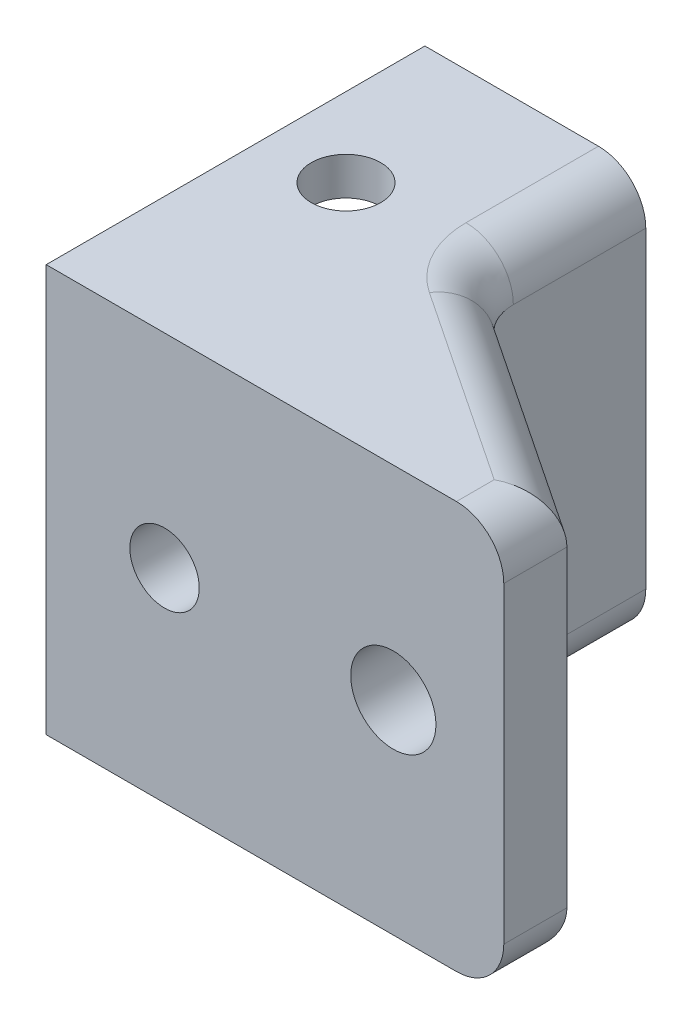
ISO-10303-21;
HEADER;
FILE_DESCRIPTION(('STEP AP214'),'2;1');
FILE_NAME('part.step','',(''),(''),'','','');
FILE_SCHEMA(('AUTOMOTIVE_DESIGN { 1 0 10303 214 1 1 1 1 }'));
ENDSEC;
DATA;
#1=APPLICATION_CONTEXT('core data for automotive mechanical design processes');
#2=APPLICATION_PROTOCOL_DEFINITION('international standard','automotive_design',2000,#1);
#3=PRODUCT_CONTEXT('',#1,'mechanical');
#4=PRODUCT('Part','Part','',(#3));
#5=PRODUCT_RELATED_PRODUCT_CATEGORY('part','',(#4));
#6=PRODUCT_DEFINITION_FORMATION('','',#4);
#7=PRODUCT_DEFINITION_CONTEXT('part definition',#1,'design');
#8=PRODUCT_DEFINITION('design','',#6,#7);
#9=PRODUCT_DEFINITION_SHAPE('','',#8);
#10=(LENGTH_UNIT() NAMED_UNIT(*) SI_UNIT(.MILLI.,.METRE.));
#11=(NAMED_UNIT(*) PLANE_ANGLE_UNIT() SI_UNIT($,.RADIAN.));
#12=(NAMED_UNIT(*) SI_UNIT($,.STERADIAN.) SOLID_ANGLE_UNIT());
#13=UNCERTAINTY_MEASURE_WITH_UNIT(LENGTH_MEASURE(1.E-05),#10,'distance_accuracy_value','');
#14=(GEOMETRIC_REPRESENTATION_CONTEXT(3) GLOBAL_UNCERTAINTY_ASSIGNED_CONTEXT((#13)) GLOBAL_UNIT_ASSIGNED_CONTEXT((#10,
#11,#12)) REPRESENTATION_CONTEXT('',''));
#15=CARTESIAN_POINT('',(0.,0.,0.));
#16=DIRECTION('',(0.,0.,1.));
#17=DIRECTION('',(1.,0.,0.));
#18=AXIS2_PLACEMENT_3D('',#15,#16,#17);
#19=CARTESIAN_POINT('',(0.,0.,0.));
#20=DIRECTION('',(0.,0.,1.));
#21=DIRECTION('',(1.,0.,0.));
#22=AXIS2_PLACEMENT_3D('',#19,#20,#21);
#23=PLANE('',#22);
#24=CARTESIAN_POINT('',(0.,0.,0.));
#25=DIRECTION('',(0.,0.,1.));
#26=DIRECTION('',(1.,0.,0.));
#27=AXIS2_PLACEMENT_3D('',#24,#25,#26);
#28=CIRCLE('',#27,2.7);
#29=CARTESIAN_POINT('',(2.7,0.,0.));
#30=VERTEX_POINT('',#29);
#31=EDGE_CURVE('E688',#30,#30,#28,.T.);
#32=ORIENTED_EDGE('',*,*,#31,.T.);
#33=EDGE_LOOP('',(#32));
#34=FACE_BOUND('',#33,.T.);
#35=DIRECTION('',(1.,0.,0.));
#36=VECTOR('',#35,1.);
#37=CARTESIAN_POINT('',(0.,-9.9,0.));
#38=LINE('',#37,#36);
#39=CARTESIAN_POINT('',(-8.,-9.9,0.));
#40=VERTEX_POINT('',#39);
#41=CARTESIAN_POINT('',(7.,-9.9,0.));
#42=VERTEX_POINT('',#41);
#43=EDGE_CURVE('E173',#40,#42,#38,.T.);
#44=ORIENTED_EDGE('',*,*,#43,.F.);
#45=DIRECTION('',(0.,-1.,0.));
#46=VECTOR('',#45,1.);
#47=CARTESIAN_POINT('',(-8.,0.,0.));
#48=LINE('',#47,#46);
#49=CARTESIAN_POINT('',(-8.,9.9,0.));
#50=VERTEX_POINT('',#49);
#51=EDGE_CURVE('E158',#50,#40,#48,.T.);
#52=ORIENTED_EDGE('',*,*,#51,.F.);
#53=DIRECTION('',(-1.,0.,0.));
#54=VECTOR('',#53,1.);
#55=CARTESIAN_POINT('',(0.,9.9,0.));
#56=LINE('',#55,#54);
#57=CARTESIAN_POINT('',(7.,9.9,0.));
#58=VERTEX_POINT('',#57);
#59=EDGE_CURVE('E186',#58,#50,#56,.T.);
#60=ORIENTED_EDGE('',*,*,#59,.F.);
#61=DIRECTION('',(0.,-1.,0.));
#62=VECTOR('',#61,1.);
#63=CARTESIAN_POINT('',(7.,0.,0.));
#64=LINE('',#63,#62);
#65=EDGE_CURVE('E174',#58,#42,#64,.T.);
#66=ORIENTED_EDGE('',*,*,#65,.T.);
#67=EDGE_LOOP('',(#44,#52,#60,#66));
#68=FACE_BOUND('',#67,.T.);
#69=ADVANCED_FACE('F37',(#34,#68),#23,.F.);
#70=CARTESIAN_POINT('',(0.,12.9,4.));
#71=DIRECTION('',(0.,1.,0.));
#72=DIRECTION('',(-1.,0.,0.));
#73=AXIS2_PLACEMENT_3D('',#70,#71,#72);
#74=PLANE('',#73);
#75=CARTESIAN_POINT('',(-5.,12.9,-11.605551275464));
#76=DIRECTION('',(0.,1.,0.));
#77=DIRECTION('',(-1.,0.,0.));
#78=AXIS2_PLACEMENT_3D('',#75,#76,#77);
#79=CIRCLE('',#78,6.);
#80=CARTESIAN_POINT('',(-11.,12.9,-11.605551275464));
#81=VERTEX_POINT('',#80);
#82=CARTESIAN_POINT('',(-8.32820117735137,12.9,-6.61324950943693));
#83=VERTEX_POINT('',#82);
#84=EDGE_CURVE('E375',#81,#83,#79,.T.);
#85=ORIENTED_EDGE('',*,*,#84,.F.);
#86=DIRECTION('',(0.,0.,1.));
#87=VECTOR('',#86,1.);
#88=CARTESIAN_POINT('',(-11.,12.9,-20.));
#89=LINE('',#88,#87);
#90=CARTESIAN_POINT('',(-11.,12.9,-20.));
#91=VERTEX_POINT('',#90);
#92=EDGE_CURVE('E381',#81,#91,#89,.F.);
#93=ORIENTED_EDGE('',*,*,#92,.T.);
#94=DIRECTION('',(1.,0.,0.));
#95=VECTOR('',#94,1.);
#96=CARTESIAN_POINT('',(0.,12.9,-20.));
#97=LINE('',#96,#95);
#98=CARTESIAN_POINT('',(-22.,12.9,-20.));
#99=VERTEX_POINT('',#98);
#100=EDGE_CURVE('E219',#99,#91,#97,.T.);
#101=ORIENTED_EDGE('',*,*,#100,.F.);
#102=DIRECTION('',(0.,0.,-1.));
#103=VECTOR('',#102,1.);
#104=CARTESIAN_POINT('',(-22.,12.9,4.));
#105=LINE('',#104,#103);
#106=CARTESIAN_POINT('',(-22.,12.9,4.));
#107=VERTEX_POINT('',#106);
#108=EDGE_CURVE('E278',#107,#99,#105,.T.);
#109=ORIENTED_EDGE('',*,*,#108,.F.);
#110=DIRECTION('',(1.,0.,0.));
#111=VECTOR('',#110,1.);
#112=CARTESIAN_POINT('',(0.,12.9,4.));
#113=LINE('',#112,#111);
#114=CARTESIAN_POINT('',(4.,12.9,4.));
#115=VERTEX_POINT('',#114);
#116=EDGE_CURVE('E255',#107,#115,#113,.T.);
#117=ORIENTED_EDGE('',*,*,#116,.T.);
#118=DIRECTION('',(0.,0.,-1.));
#119=VECTOR('',#118,1.);
#120=CARTESIAN_POINT('',(4.,12.9,4.));
#121=LINE('',#120,#119);
#122=CARTESIAN_POINT('',(4.,12.9,1.60555127546399));
#123=VERTEX_POINT('',#122);
#124=EDGE_CURVE('E249',#115,#123,#121,.T.);
#125=ORIENTED_EDGE('',*,*,#124,.T.);
#126=DIRECTION('',(-0.832050294337844,0.,-0.554700196225229));
#127=VECTOR('',#126,1.);
#128=CARTESIAN_POINT('',(2.33589941132431,12.9,0.49615088301353));
#129=LINE('',#128,#127);
#130=EDGE_CURVE('E374',#123,#83,#129,.T.);
#131=ORIENTED_EDGE('',*,*,#130,.T.);
#132=EDGE_LOOP('',(#85,#93,#101,#109,#117,#125,#131));
#133=FACE_BOUND('',#132,.T.);
#134=CARTESIAN_POINT('',(-17.,12.9,-10.));
#135=DIRECTION('',(0.,1.,0.));
#136=DIRECTION('',(-1.,0.,0.));
#137=AXIS2_PLACEMENT_3D('',#134,#135,#136);
#138=CIRCLE('',#137,2.19999999999999);
#139=CARTESIAN_POINT('',(-19.2,12.9,-10.));
#140=VERTEX_POINT('',#139);
#141=EDGE_CURVE('E199',#140,#140,#138,.T.);
#142=ORIENTED_EDGE('',*,*,#141,.F.);
#143=EDGE_LOOP('',(#142));
#144=FACE_BOUND('',#143,.T.);
#145=ADVANCED_FACE('F378',(#133,#144),#74,.T.);
#146=CARTESIAN_POINT('',(-22.,0.,4.));
#147=DIRECTION('',(1.,0.,0.));
#148=DIRECTION('',(0.,1.,0.));
#149=AXIS2_PLACEMENT_3D('',#146,#147,#148);
#150=PLANE('',#149);
#151=DIRECTION('',(0.,-1.,0.));
#152=VECTOR('',#151,1.);
#153=CARTESIAN_POINT('',(-22.,0.,-20.));
#154=LINE('',#153,#152);
#155=CARTESIAN_POINT('',(-22.,-10.5,-20.));
#156=VERTEX_POINT('',#155);
#157=CARTESIAN_POINT('',(-22.,-12.9,-20.));
#158=VERTEX_POINT('',#157);
#159=EDGE_CURVE('E210',#156,#158,#154,.T.);
#160=ORIENTED_EDGE('',*,*,#159,.T.);
#161=DIRECTION('',(0.,0.,-1.));
#162=VECTOR('',#161,1.);
#163=CARTESIAN_POINT('',(-22.,-12.9,4.));
#164=LINE('',#163,#162);
#165=CARTESIAN_POINT('',(-22.,-12.9,4.));
#166=VERTEX_POINT('',#165);
#167=EDGE_CURVE('E271',#166,#158,#164,.T.);
#168=ORIENTED_EDGE('',*,*,#167,.F.);
#169=DIRECTION('',(0.,-1.,0.));
#170=VECTOR('',#169,1.);
#171=CARTESIAN_POINT('',(-22.,0.,4.));
#172=LINE('',#171,#170);
#173=EDGE_CURVE('E258',#107,#166,#172,.T.);
#174=ORIENTED_EDGE('',*,*,#173,.F.);
#175=ORIENTED_EDGE('',*,*,#108,.T.);
#176=DIRECTION('',(0.,1.,0.));
#177=VECTOR('',#176,1.);
#178=CARTESIAN_POINT('',(-22.,0.,-20.));
#179=LINE('',#178,#177);
#180=CARTESIAN_POINT('',(-22.,10.5,-20.));
#181=VERTEX_POINT('',#180);
#182=EDGE_CURVE('E222',#181,#99,#179,.T.);
#183=ORIENTED_EDGE('',*,*,#182,.F.);
#184=DIRECTION('',(0.,0.,1.));
#185=VECTOR('',#184,1.);
#186=CARTESIAN_POINT('',(-22.,10.5,-20.));
#187=LINE('',#186,#185);
#188=CARTESIAN_POINT('',(-22.,10.5,0.));
#189=VERTEX_POINT('',#188);
#190=EDGE_CURVE('E243',#181,#189,#187,.T.);
#191=ORIENTED_EDGE('',*,*,#190,.T.);
#192=DIRECTION('',(0.,-1.,0.));
#193=VECTOR('',#192,1.);
#194=CARTESIAN_POINT('',(-22.,0.,0.));
#195=LINE('',#194,#193);
#196=CARTESIAN_POINT('',(-22.,-10.5,0.));
#197=VERTEX_POINT('',#196);
#198=EDGE_CURVE('E276',#189,#197,#195,.T.);
#199=ORIENTED_EDGE('',*,*,#198,.T.);
#200=DIRECTION('',(0.,0.,1.));
#201=VECTOR('',#200,1.);
#202=CARTESIAN_POINT('',(-22.,-10.5,-20.));
#203=LINE('',#202,#201);
#204=EDGE_CURVE('E240',#156,#197,#203,.T.);
#205=ORIENTED_EDGE('',*,*,#204,.F.);
#206=EDGE_LOOP('',(#160,#168,#174,#175,#183,#191,#199,#205));
#207=FACE_BOUND('',#206,.T.);
#208=ADVANCED_FACE('F283',(#207),#150,.F.);
#209=CARTESIAN_POINT('',(0.,-12.9,4.));
#210=DIRECTION('',(0.,1.,0.));
#211=DIRECTION('',(-1.,0.,0.));
#212=AXIS2_PLACEMENT_3D('',#209,#210,#211);
#213=PLANE('',#212);
#214=DIRECTION('',(1.,0.,0.));
#215=VECTOR('',#214,1.);
#216=CARTESIAN_POINT('',(0.,-12.9,-20.));
#217=LINE('',#216,#215);
#218=CARTESIAN_POINT('',(-11.,-12.9,-20.));
#219=VERTEX_POINT('',#218);
#220=EDGE_CURVE('E213',#158,#219,#217,.T.);
#221=ORIENTED_EDGE('',*,*,#220,.T.);
#222=DIRECTION('',(0.,0.,1.));
#223=VECTOR('',#222,1.);
#224=CARTESIAN_POINT('',(-11.,-12.9,4.));
#225=LINE('',#224,#223);
#226=CARTESIAN_POINT('',(-11.,-12.9,-11.605551275464));
#227=VERTEX_POINT('',#226);
#228=EDGE_CURVE('E352',#219,#227,#225,.T.);
#229=ORIENTED_EDGE('',*,*,#228,.T.);
#230=CARTESIAN_POINT('',(-5.,-12.9,-11.605551275464));
#231=DIRECTION('',(0.,1.,0.));
#232=DIRECTION('',(-1.,0.,0.));
#233=AXIS2_PLACEMENT_3D('',#230,#231,#232);
#234=CIRCLE('',#233,6.);
#235=CARTESIAN_POINT('',(-8.32820117735137,-12.9,-6.61324950943693));
#236=VERTEX_POINT('',#235);
#237=EDGE_CURVE('E348',#236,#227,#234,.F.);
#238=ORIENTED_EDGE('',*,*,#237,.F.);
#239=DIRECTION('',(0.832050294337844,0.,0.554700196225229));
#240=VECTOR('',#239,1.);
#241=CARTESIAN_POINT('',(5.33589941132431,-12.9,2.49615088301353));
#242=LINE('',#241,#240);
#243=CARTESIAN_POINT('',(4.,-12.9,1.60555127546399));
#244=VERTEX_POINT('',#243);
#245=EDGE_CURVE('E386',#236,#244,#242,.T.);
#246=ORIENTED_EDGE('',*,*,#245,.T.);
#247=DIRECTION('',(0.,0.,-1.));
#248=VECTOR('',#247,1.);
#249=CARTESIAN_POINT('',(4.,-12.9,4.));
#250=LINE('',#249,#248);
#251=CARTESIAN_POINT('',(4.,-12.9,4.));
#252=VERTEX_POINT('',#251);
#253=EDGE_CURVE('E315',#244,#252,#250,.F.);
#254=ORIENTED_EDGE('',*,*,#253,.T.);
#255=DIRECTION('',(1.,0.,0.));
#256=VECTOR('',#255,1.);
#257=CARTESIAN_POINT('',(0.,-12.9,4.));
#258=LINE('',#257,#256);
#259=EDGE_CURVE('E261',#166,#252,#258,.T.);
#260=ORIENTED_EDGE('',*,*,#259,.F.);
#261=ORIENTED_EDGE('',*,*,#167,.T.);
#262=EDGE_LOOP('',(#221,#229,#238,#246,#254,#260,#261));
#263=FACE_BOUND('',#262,.T.);
#264=CARTESIAN_POINT('',(-17.,-12.9,-10.));
#265=DIRECTION('',(0.,-1.,0.));
#266=DIRECTION('',(0.,0.,-1.));
#267=AXIS2_PLACEMENT_3D('',#264,#265,#266);
#268=CIRCLE('',#267,2.19999999999999);
#269=CARTESIAN_POINT('',(-17.,-12.9,-12.2));
#270=VERTEX_POINT('',#269);
#271=EDGE_CURVE('E192',#270,#270,#268,.T.);
#272=ORIENTED_EDGE('',*,*,#271,.F.);
#273=EDGE_LOOP('',(#272));
#274=FACE_BOUND('',#273,.T.);
#275=ADVANCED_FACE('F312',(#263,#274),#213,.F.);
#276=CARTESIAN_POINT('',(0.,0.,4.));
#277=DIRECTION('',(0.,0.,-1.));
#278=DIRECTION('',(-1.,0.,0.));
#279=AXIS2_PLACEMENT_3D('',#276,#277,#278);
#280=CYLINDRICAL_SURFACE('',#279,2.7);
#281=CARTESIAN_POINT('',(0.,0.,4.));
#282=DIRECTION('',(0.,0.,1.));
#283=DIRECTION('',(1.,0.,0.));
#284=AXIS2_PLACEMENT_3D('',#281,#282,#283);
#285=CIRCLE('',#284,2.7);
#286=CARTESIAN_POINT('',(2.7,0.,4.));
#287=VERTEX_POINT('',#286);
#288=EDGE_CURVE('E265',#287,#287,#285,.T.);
#289=ORIENTED_EDGE('',*,*,#288,.T.);
#290=EDGE_LOOP('',(#289));
#291=FACE_BOUND('',#290,.T.);
#292=ORIENTED_EDGE('',*,*,#31,.F.);
#293=EDGE_LOOP('',(#292));
#294=FACE_BOUND('',#293,.T.);
#295=ADVANCED_FACE('F522',(#291,#294),#280,.F.);
#296=CARTESIAN_POINT('',(7.,0.,4.));
#297=DIRECTION('',(1.,0.,0.));
#298=DIRECTION('',(0.,0.,-1.));
#299=AXIS2_PLACEMENT_3D('',#296,#297,#298);
#300=PLANE('',#299);
#301=DIRECTION('',(0.,-1.,0.));
#302=VECTOR('',#301,1.);
#303=CARTESIAN_POINT('',(7.,0.,4.));
#304=LINE('',#303,#302);
#305=CARTESIAN_POINT('',(7.,9.9,4.));
#306=VERTEX_POINT('',#305);
#307=CARTESIAN_POINT('',(7.,-9.9,4.));
#308=VERTEX_POINT('',#307);
#309=EDGE_CURVE('E263',#306,#308,#304,.T.);
#310=ORIENTED_EDGE('',*,*,#309,.T.);
#311=DIRECTION('',(0.,0.,-1.));
#312=VECTOR('',#311,1.);
#313=CARTESIAN_POINT('',(7.,-9.9,0.));
#314=LINE('',#313,#312);
#315=EDGE_CURVE('E322',#308,#42,#314,.T.);
#316=ORIENTED_EDGE('',*,*,#315,.T.);
#317=ORIENTED_EDGE('',*,*,#65,.F.);
#318=DIRECTION('',(0.,0.,-1.));
#319=VECTOR('',#318,1.);
#320=CARTESIAN_POINT('',(7.,9.9,4.));
#321=LINE('',#320,#319);
#322=EDGE_CURVE('E61',#58,#306,#321,.F.);
#323=ORIENTED_EDGE('',*,*,#322,.T.);
#324=EDGE_LOOP('',(#310,#316,#317,#323));
#325=FACE_BOUND('',#324,.T.);
#326=ADVANCED_FACE('F364',(#325),#300,.T.);
#327=CARTESIAN_POINT('',(-14.5,0.,4.));
#328=DIRECTION('',(0.,0.,-1.));
#329=DIRECTION('',(-1.,0.,0.));
#330=AXIS2_PLACEMENT_3D('',#327,#328,#329);
#331=CYLINDRICAL_SURFACE('',#330,2.2);
#332=CARTESIAN_POINT('',(-14.5,0.,4.));
#333=DIRECTION('',(0.,0.,1.));
#334=DIRECTION('',(1.,0.,0.));
#335=AXIS2_PLACEMENT_3D('',#332,#333,#334);
#336=CIRCLE('',#335,2.2);
#337=CARTESIAN_POINT('',(-12.3,0.,4.));
#338=VERTEX_POINT('',#337);
#339=EDGE_CURVE('E268',#338,#338,#336,.T.);
#340=ORIENTED_EDGE('',*,*,#339,.T.);
#341=EDGE_LOOP('',(#340));
#342=FACE_BOUND('',#341,.T.);
#343=CARTESIAN_POINT('',(-14.5,0.,0.));
#344=DIRECTION('',(0.,0.,1.));
#345=DIRECTION('',(1.,0.,0.));
#346=AXIS2_PLACEMENT_3D('',#343,#344,#345);
#347=CIRCLE('',#346,2.2);
#348=CARTESIAN_POINT('',(-12.3,0.,0.));
#349=VERTEX_POINT('',#348);
#350=EDGE_CURVE('E259',#349,#349,#347,.T.);
#351=ORIENTED_EDGE('',*,*,#350,.F.);
#352=EDGE_LOOP('',(#351));
#353=FACE_BOUND('',#352,.T.);
#354=ADVANCED_FACE('F424',(#342,#353),#331,.F.);
#355=CARTESIAN_POINT('',(0.,0.,4.));
#356=DIRECTION('',(0.,0.,1.));
#357=DIRECTION('',(1.,0.,0.));
#358=AXIS2_PLACEMENT_3D('',#355,#356,#357);
#359=PLANE('',#358);
#360=ORIENTED_EDGE('',*,*,#259,.T.);
#361=CARTESIAN_POINT('',(4.,-9.9,4.));
#362=DIRECTION('',(0.,0.,1.));
#363=DIRECTION('',(1.,0.,0.));
#364=AXIS2_PLACEMENT_3D('',#361,#362,#363);
#365=CIRCLE('',#364,3.);
#366=EDGE_CURVE('E54',#252,#308,#365,.T.);
#367=ORIENTED_EDGE('',*,*,#366,.T.);
#368=ORIENTED_EDGE('',*,*,#309,.F.);
#369=CARTESIAN_POINT('',(4.,9.9,4.));
#370=DIRECTION('',(0.,0.,1.));
#371=DIRECTION('',(1.,0.,0.));
#372=AXIS2_PLACEMENT_3D('',#369,#370,#371);
#373=CIRCLE('',#372,3.);
#374=EDGE_CURVE('E323',#306,#115,#373,.T.);
#375=ORIENTED_EDGE('',*,*,#374,.T.);
#376=ORIENTED_EDGE('',*,*,#116,.F.);
#377=ORIENTED_EDGE('',*,*,#173,.T.);
#378=EDGE_LOOP('',(#360,#367,#368,#375,#376,#377));
#379=FACE_BOUND('',#378,.T.);
#380=ORIENTED_EDGE('',*,*,#288,.F.);
#381=EDGE_LOOP('',(#380));
#382=FACE_BOUND('',#381,.T.);
#383=ORIENTED_EDGE('',*,*,#339,.F.);
#384=EDGE_LOOP('',(#383));
#385=FACE_BOUND('',#384,.T.);
#386=ADVANCED_FACE('F316',(#379,#382,#385),#359,.T.);
#387=DIRECTION('',(1.,0.,0.));
#388=VECTOR('',#387,1.);
#389=CARTESIAN_POINT('',(0.,-10.5,0.));
#390=LINE('',#389,#388);
#391=CARTESIAN_POINT('',(-10.,-10.5,0.));
#392=VERTEX_POINT('',#391);
#393=EDGE_CURVE('E169',#197,#392,#390,.T.);
#394=ORIENTED_EDGE('',*,*,#393,.F.);
#395=ORIENTED_EDGE('',*,*,#198,.F.);
#396=DIRECTION('',(1.,0.,0.));
#397=VECTOR('',#396,1.);
#398=CARTESIAN_POINT('',(0.,10.5,0.));
#399=LINE('',#398,#397);
#400=CARTESIAN_POINT('',(-10.,10.5,0.));
#401=VERTEX_POINT('',#400);
#402=EDGE_CURVE('E202',#189,#401,#399,.T.);
#403=ORIENTED_EDGE('',*,*,#402,.T.);
#404=DIRECTION('',(0.,-1.,0.));
#405=VECTOR('',#404,1.);
#406=CARTESIAN_POINT('',(-10.,0.,0.));
#407=LINE('',#406,#405);
#408=EDGE_CURVE('E228',#401,#392,#407,.T.);
#409=ORIENTED_EDGE('',*,*,#408,.T.);
#410=EDGE_LOOP('',(#394,#395,#403,#409));
#411=FACE_BOUND('',#410,.T.);
#412=ORIENTED_EDGE('',*,*,#350,.T.);
#413=EDGE_LOOP('',(#412));
#414=FACE_BOUND('',#413,.T.);
#415=ADVANCED_FACE('F289',(#411,#414),#23,.F.);
#416=CARTESIAN_POINT('',(0.,10.5,-20.));
#417=DIRECTION('',(0.,-1.,0.));
#418=DIRECTION('',(0.,0.,-1.));
#419=AXIS2_PLACEMENT_3D('',#416,#417,#418);
#420=PLANE('',#419);
#421=DIRECTION('',(0.,0.,1.));
#422=VECTOR('',#421,1.);
#423=CARTESIAN_POINT('',(-10.,10.5,-20.));
#424=LINE('',#423,#422);
#425=CARTESIAN_POINT('',(-10.,10.5,-20.));
#426=VERTEX_POINT('',#425);
#427=EDGE_CURVE('E225',#426,#401,#424,.T.);
#428=ORIENTED_EDGE('',*,*,#427,.T.);
#429=ORIENTED_EDGE('',*,*,#402,.F.);
#430=ORIENTED_EDGE('',*,*,#190,.F.);
#431=DIRECTION('',(1.,0.,0.));
#432=VECTOR('',#431,1.);
#433=CARTESIAN_POINT('',(0.,10.5,-20.));
#434=LINE('',#433,#432);
#435=EDGE_CURVE('E168',#181,#426,#434,.T.);
#436=ORIENTED_EDGE('',*,*,#435,.T.);
#437=EDGE_LOOP('',(#428,#429,#430,#436));
#438=FACE_BOUND('',#437,.T.);
#439=CARTESIAN_POINT('',(-17.,10.5,-10.));
#440=DIRECTION('',(0.,-1.,0.));
#441=DIRECTION('',(0.,0.,-1.));
#442=AXIS2_PLACEMENT_3D('',#439,#440,#441);
#443=CIRCLE('',#442,2.19999999999999);
#444=CARTESIAN_POINT('',(-17.,10.5,-12.2));
#445=VERTEX_POINT('',#444);
#446=EDGE_CURVE('E196',#445,#445,#443,.T.);
#447=ORIENTED_EDGE('',*,*,#446,.F.);
#448=EDGE_LOOP('',(#447));
#449=FACE_BOUND('',#448,.T.);
#450=ADVANCED_FACE('F293',(#438,#449),#420,.T.);
#451=CARTESIAN_POINT('',(-8.,0.,-20.));
#452=DIRECTION('',(-1.,0.,0.));
#453=DIRECTION('',(0.,0.,1.));
#454=AXIS2_PLACEMENT_3D('',#451,#452,#453);
#455=PLANE('',#454);
#456=DIRECTION('',(0.,0.,1.));
#457=VECTOR('',#456,1.);
#458=CARTESIAN_POINT('',(-8.,-9.9,-20.));
#459=LINE('',#458,#457);
#460=CARTESIAN_POINT('',(-8.,-9.9,-11.605551275464));
#461=VERTEX_POINT('',#460);
#462=EDGE_CURVE('E162',#461,#40,#459,.T.);
#463=ORIENTED_EDGE('',*,*,#462,.F.);
#464=DIRECTION('',(0.,0.,1.));
#465=VECTOR('',#464,1.);
#466=CARTESIAN_POINT('',(-8.,-9.9,-20.));
#467=LINE('',#466,#465);
#468=CARTESIAN_POINT('',(-8.,-9.9,-20.));
#469=VERTEX_POINT('',#468);
#470=EDGE_CURVE('E353',#461,#469,#467,.F.);
#471=ORIENTED_EDGE('',*,*,#470,.T.);
#472=DIRECTION('',(0.,-1.,0.));
#473=VECTOR('',#472,1.);
#474=CARTESIAN_POINT('',(-8.,0.,-20.));
#475=LINE('',#474,#473);
#476=CARTESIAN_POINT('',(-8.,9.9,-20.));
#477=VERTEX_POINT('',#476);
#478=EDGE_CURVE('E216',#477,#469,#475,.T.);
#479=ORIENTED_EDGE('',*,*,#478,.F.);
#480=DIRECTION('',(0.,0.,1.));
#481=VECTOR('',#480,1.);
#482=CARTESIAN_POINT('',(-8.,9.9,-10.));
#483=LINE('',#482,#481);
#484=CARTESIAN_POINT('',(-8.,9.9,-11.605551275464));
#485=VERTEX_POINT('',#484);
#486=EDGE_CURVE('E356',#477,#485,#483,.T.);
#487=ORIENTED_EDGE('',*,*,#486,.T.);
#488=DIRECTION('',(0.,0.,-1.));
#489=VECTOR('',#488,1.);
#490=CARTESIAN_POINT('',(-8.,9.9,-20.));
#491=LINE('',#490,#489);
#492=EDGE_CURVE('E165',#50,#485,#491,.T.);
#493=ORIENTED_EDGE('',*,*,#492,.F.);
#494=ORIENTED_EDGE('',*,*,#51,.T.);
#495=EDGE_LOOP('',(#463,#471,#479,#487,#493,#494));
#496=FACE_BOUND('',#495,.T.);
#497=ADVANCED_FACE('F160',(#496),#455,.F.);
#498=CARTESIAN_POINT('',(0.,-10.5,-20.));
#499=DIRECTION('',(0.,-1.,0.));
#500=DIRECTION('',(0.,0.,-1.));
#501=AXIS2_PLACEMENT_3D('',#498,#499,#500);
#502=PLANE('',#501);
#503=ORIENTED_EDGE('',*,*,#204,.T.);
#504=ORIENTED_EDGE('',*,*,#393,.T.);
#505=DIRECTION('',(0.,0.,1.));
#506=VECTOR('',#505,1.);
#507=CARTESIAN_POINT('',(-10.,-10.5,-20.));
#508=LINE('',#507,#506);
#509=CARTESIAN_POINT('',(-10.,-10.5,-20.));
#510=VERTEX_POINT('',#509);
#511=EDGE_CURVE('E244',#510,#392,#508,.T.);
#512=ORIENTED_EDGE('',*,*,#511,.F.);
#513=DIRECTION('',(1.,0.,0.));
#514=VECTOR('',#513,1.);
#515=CARTESIAN_POINT('',(0.,-10.5,-20.));
#516=LINE('',#515,#514);
#517=EDGE_CURVE('E208',#156,#510,#516,.T.);
#518=ORIENTED_EDGE('',*,*,#517,.F.);
#519=EDGE_LOOP('',(#503,#504,#512,#518));
#520=FACE_BOUND('',#519,.T.);
#521=CARTESIAN_POINT('',(-17.,-10.5,-10.));
#522=DIRECTION('',(0.,-1.,0.));
#523=DIRECTION('',(0.,0.,-1.));
#524=AXIS2_PLACEMENT_3D('',#521,#522,#523);
#525=CIRCLE('',#524,2.19999999999999);
#526=CARTESIAN_POINT('',(-17.,-10.5,-12.2));
#527=VERTEX_POINT('',#526);
#528=EDGE_CURVE('E195',#527,#527,#525,.T.);
#529=ORIENTED_EDGE('',*,*,#528,.T.);
#530=EDGE_LOOP('',(#529));
#531=FACE_BOUND('',#530,.T.);
#532=ADVANCED_FACE('F305',(#520,#531),#502,.F.);
#533=CARTESIAN_POINT('',(-10.,0.,-20.));
#534=DIRECTION('',(-1.,0.,0.));
#535=DIRECTION('',(0.,0.,1.));
#536=AXIS2_PLACEMENT_3D('',#533,#534,#535);
#537=PLANE('',#536);
#538=ORIENTED_EDGE('',*,*,#511,.T.);
#539=ORIENTED_EDGE('',*,*,#408,.F.);
#540=ORIENTED_EDGE('',*,*,#427,.F.);
#541=DIRECTION('',(0.,-1.,0.));
#542=VECTOR('',#541,1.);
#543=CARTESIAN_POINT('',(-10.,0.,-20.));
#544=LINE('',#543,#542);
#545=EDGE_CURVE('E205',#426,#510,#544,.T.);
#546=ORIENTED_EDGE('',*,*,#545,.T.);
#547=EDGE_LOOP('',(#538,#539,#540,#546));
#548=FACE_BOUND('',#547,.T.);
#549=ADVANCED_FACE('F297',(#548),#537,.T.);
#550=CARTESIAN_POINT('',(0.,0.,-20.));
#551=DIRECTION('',(0.,0.,1.));
#552=DIRECTION('',(1.,0.,0.));
#553=AXIS2_PLACEMENT_3D('',#550,#551,#552);
#554=PLANE('',#553);
#555=ORIENTED_EDGE('',*,*,#100,.T.);
#556=CARTESIAN_POINT('',(-11.,9.9,-20.));
#557=DIRECTION('',(0.,0.,1.));
#558=DIRECTION('',(1.,0.,0.));
#559=AXIS2_PLACEMENT_3D('',#556,#557,#558);
#560=CIRCLE('',#559,3.);
#561=EDGE_CURVE('E358',#91,#477,#560,.F.);
#562=ORIENTED_EDGE('',*,*,#561,.T.);
#563=ORIENTED_EDGE('',*,*,#478,.T.);
#564=CARTESIAN_POINT('',(-11.,-9.9,-20.));
#565=DIRECTION('',(0.,0.,1.));
#566=DIRECTION('',(1.,0.,0.));
#567=AXIS2_PLACEMENT_3D('',#564,#565,#566);
#568=CIRCLE('',#567,3.);
#569=EDGE_CURVE('E354',#469,#219,#568,.F.);
#570=ORIENTED_EDGE('',*,*,#569,.T.);
#571=ORIENTED_EDGE('',*,*,#220,.F.);
#572=ORIENTED_EDGE('',*,*,#159,.F.);
#573=ORIENTED_EDGE('',*,*,#517,.T.);
#574=ORIENTED_EDGE('',*,*,#545,.F.);
#575=ORIENTED_EDGE('',*,*,#435,.F.);
#576=ORIENTED_EDGE('',*,*,#182,.T.);
#577=EDGE_LOOP('',(#555,#562,#563,#570,#571,#572,#573,#574,#575,#576));
#578=FACE_BOUND('',#577,.T.);
#579=ADVANCED_FACE('F299',(#578),#554,.F.);
#580=CARTESIAN_POINT('',(-17.,12.90005,-10.));
#581=DIRECTION('',(0.,-1.,0.));
#582=DIRECTION('',(0.,0.,-1.));
#583=AXIS2_PLACEMENT_3D('',#580,#581,#582);
#584=CYLINDRICAL_SURFACE('',#583,2.19999999999999);
#585=ORIENTED_EDGE('',*,*,#271,.T.);
#586=EDGE_LOOP('',(#585));
#587=FACE_BOUND('',#586,.T.);
#588=ORIENTED_EDGE('',*,*,#528,.F.);
#589=EDGE_LOOP('',(#588));
#590=FACE_BOUND('',#589,.T.);
#591=ADVANCED_FACE('F438',(#587,#590),#584,.F.);
#592=ORIENTED_EDGE('',*,*,#141,.T.);
#593=EDGE_LOOP('',(#592));
#594=FACE_BOUND('',#593,.T.);
#595=ORIENTED_EDGE('',*,*,#446,.T.);
#596=EDGE_LOOP('',(#595));
#597=FACE_BOUND('',#596,.T.);
#598=ADVANCED_FACE('F439',(#594,#597),#584,.F.);
#599=CARTESIAN_POINT('',(-7.5000125,9.9,-8.0000125));
#600=DIRECTION('',(0.,1.,0.));
#601=DIRECTION('',(-1.,0.,0.));
#602=AXIS2_PLACEMENT_3D('',#599,#600,#601);
#603=PLANE('',#602);
#604=ORIENTED_EDGE('',*,*,#59,.T.);
#605=ORIENTED_EDGE('',*,*,#492,.T.);
#606=CARTESIAN_POINT('',(-5.,9.9,-11.605551275464));
#607=DIRECTION('',(0.,1.,0.));
#608=DIRECTION('',(-1.,0.,0.));
#609=AXIS2_PLACEMENT_3D('',#606,#607,#608);
#610=CIRCLE('',#609,3.);
#611=CARTESIAN_POINT('',(-6.66410058867568,9.9,-9.10940039245046));
#612=VERTEX_POINT('',#611);
#613=EDGE_CURVE('E11',#485,#612,#610,.T.);
#614=ORIENTED_EDGE('',*,*,#613,.T.);
#615=DIRECTION('',(-0.832050294337844,0.,-0.554700196225229));
#616=VECTOR('',#615,1.);
#617=CARTESIAN_POINT('',(7.,9.9,0.));
#618=LINE('',#617,#616);
#619=EDGE_CURVE('E183',#58,#612,#618,.T.);
#620=ORIENTED_EDGE('',*,*,#619,.F.);
#621=EDGE_LOOP('',(#604,#605,#614,#620));
#622=FACE_BOUND('',#621,.T.);
#623=ADVANCED_FACE('F398',(#622),#603,.F.);
#624=CARTESIAN_POINT('',(-7.5000125,-9.9,-8.0000125));
#625=DIRECTION('',(0.,-1.,0.));
#626=DIRECTION('',(1.,0.,0.));
#627=AXIS2_PLACEMENT_3D('',#624,#625,#626);
#628=PLANE('',#627);
#629=DIRECTION('',(-0.832050294337844,0.,-0.554700196225229));
#630=VECTOR('',#629,1.);
#631=CARTESIAN_POINT('',(7.,-9.9,0.));
#632=LINE('',#631,#630);
#633=CARTESIAN_POINT('',(-6.66410058867569,-9.9,-9.10940039245046));
#634=VERTEX_POINT('',#633);
#635=EDGE_CURVE('E178',#42,#634,#632,.T.);
#636=ORIENTED_EDGE('',*,*,#635,.T.);
#637=CARTESIAN_POINT('',(-5.,-9.9,-11.605551275464));
#638=DIRECTION('',(0.,-1.,0.));
#639=DIRECTION('',(1.,0.,0.));
#640=AXIS2_PLACEMENT_3D('',#637,#638,#639);
#641=CIRCLE('',#640,3.);
#642=EDGE_CURVE('E46',#634,#461,#641,.T.);
#643=ORIENTED_EDGE('',*,*,#642,.T.);
#644=ORIENTED_EDGE('',*,*,#462,.T.);
#645=ORIENTED_EDGE('',*,*,#43,.T.);
#646=EDGE_LOOP('',(#636,#643,#644,#645));
#647=FACE_BOUND('',#646,.T.);
#648=ADVANCED_FACE('F180',(#647),#628,.F.);
#649=CARTESIAN_POINT('',(-11.,9.9,-20.));
#650=DIRECTION('',(0.,0.,-1.));
#651=DIRECTION('',(-1.,0.,0.));
#652=AXIS2_PLACEMENT_3D('',#649,#650,#651);
#653=CYLINDRICAL_SURFACE('',#652,3.);
#654=ORIENTED_EDGE('',*,*,#561,.F.);
#655=ORIENTED_EDGE('',*,*,#92,.F.);
#656=CARTESIAN_POINT('',(-11.,9.9,-11.605551275464));
#657=DIRECTION('',(0.,0.,1.));
#658=DIRECTION('',(1.,0.,0.));
#659=AXIS2_PLACEMENT_3D('',#656,#657,#658);
#660=CIRCLE('',#659,3.);
#661=EDGE_CURVE('E334',#485,#81,#660,.T.);
#662=ORIENTED_EDGE('',*,*,#661,.F.);
#663=ORIENTED_EDGE('',*,*,#486,.F.);
#664=EDGE_LOOP('',(#654,#655,#662,#663));
#665=FACE_BOUND('',#664,.T.);
#666=ADVANCED_FACE('F392',(#665),#653,.T.);
#667=CARTESIAN_POINT('',(4.,9.9,4.));
#668=DIRECTION('',(0.,0.,-1.));
#669=DIRECTION('',(-1.,0.,0.));
#670=AXIS2_PLACEMENT_3D('',#667,#668,#669);
#671=CYLINDRICAL_SURFACE('',#670,3.);
#672=ORIENTED_EDGE('',*,*,#374,.F.);
#673=ORIENTED_EDGE('',*,*,#322,.F.);
#674=CARTESIAN_POINT('',(4.,9.9,1.60555127546399));
#675=DIRECTION('',(-0.471857925532024,0.,-0.881674598767944));
#676=DIRECTION('',(0.881674598767944,0.,-0.471857925532024));
#677=AXIS2_PLACEMENT_3D('',#674,#675,#676);
#678=ELLIPSE('',#677,3.40261589047957,3.);
#679=EDGE_CURVE('E331',#123,#58,#678,.T.);
#680=ORIENTED_EDGE('',*,*,#679,.F.);
#681=ORIENTED_EDGE('',*,*,#124,.F.);
#682=EDGE_LOOP('',(#672,#673,#680,#681));
#683=FACE_BOUND('',#682,.T.);
#684=ADVANCED_FACE('F369',(#683),#671,.T.);
#685=CARTESIAN_POINT('',(-5.,9.9,-11.605551275464));
#686=DIRECTION('',(0.,1.,0.));
#687=DIRECTION('',(-1.,0.,0.));
#688=AXIS2_PLACEMENT_3D('',#685,#686,#687);
#689=TOROIDAL_SURFACE('',#688,6.,3.);
#690=ORIENTED_EDGE('',*,*,#661,.T.);
#691=ORIENTED_EDGE('',*,*,#84,.T.);
#692=CARTESIAN_POINT('',(-8.32820117735137,9.9,-6.61324950943693));
#693=DIRECTION('',(-0.832050294337843,0.,-0.554700196225229));
#694=DIRECTION('',(-0.554700196225229,0.,0.832050294337843));
#695=AXIS2_PLACEMENT_3D('',#692,#693,#694);
#696=CIRCLE('',#695,3.);
#697=EDGE_CURVE('E329',#612,#83,#696,.F.);
#698=ORIENTED_EDGE('',*,*,#697,.F.);
#699=ORIENTED_EDGE('',*,*,#613,.F.);
#700=EDGE_LOOP('',(#690,#691,#698,#699));
#701=FACE_BOUND('',#700,.T.);
#702=ADVANCED_FACE('F396',(#701),#689,.T.);
#703=CARTESIAN_POINT('',(2.33589941132431,9.9,0.49615088301353));
#704=DIRECTION('',(-0.832050294337844,0.,-0.554700196225229));
#705=DIRECTION('',(-0.554700196225229,0.,0.832050294337844));
#706=AXIS2_PLACEMENT_3D('',#703,#704,#705);
#707=CYLINDRICAL_SURFACE('',#706,3.);
#708=ORIENTED_EDGE('',*,*,#679,.T.);
#709=ORIENTED_EDGE('',*,*,#619,.T.);
#710=ORIENTED_EDGE('',*,*,#697,.T.);
#711=ORIENTED_EDGE('',*,*,#130,.F.);
#712=EDGE_LOOP('',(#708,#709,#710,#711));
#713=FACE_BOUND('',#712,.T.);
#714=ADVANCED_FACE('F400',(#713),#707,.T.);
#715=CARTESIAN_POINT('',(-11.,-9.9,4.));
#716=DIRECTION('',(0.,0.,1.));
#717=DIRECTION('',(1.,0.,0.));
#718=AXIS2_PLACEMENT_3D('',#715,#716,#717);
#719=CYLINDRICAL_SURFACE('',#718,3.);
#720=ORIENTED_EDGE('',*,*,#569,.F.);
#721=ORIENTED_EDGE('',*,*,#470,.F.);
#722=CARTESIAN_POINT('',(-11.,-9.9,-11.605551275464));
#723=DIRECTION('',(0.,0.,1.));
#724=DIRECTION('',(1.,0.,0.));
#725=AXIS2_PLACEMENT_3D('',#722,#723,#724);
#726=CIRCLE('',#725,3.);
#727=EDGE_CURVE('E41',#227,#461,#726,.T.);
#728=ORIENTED_EDGE('',*,*,#727,.F.);
#729=ORIENTED_EDGE('',*,*,#228,.F.);
#730=EDGE_LOOP('',(#720,#721,#728,#729));
#731=FACE_BOUND('',#730,.T.);
#732=ADVANCED_FACE('F39',(#731),#719,.T.);
#733=CARTESIAN_POINT('',(4.,-9.9,4.));
#734=DIRECTION('',(0.,0.,1.));
#735=DIRECTION('',(1.,0.,0.));
#736=AXIS2_PLACEMENT_3D('',#733,#734,#735);
#737=CYLINDRICAL_SURFACE('',#736,3.);
#738=ORIENTED_EDGE('',*,*,#366,.F.);
#739=ORIENTED_EDGE('',*,*,#253,.F.);
#740=CARTESIAN_POINT('',(4.,-9.9,1.60555127546399));
#741=DIRECTION('',(0.471857925532024,0.,0.881674598767944));
#742=DIRECTION('',(-0.881674598767944,0.,0.471857925532024));
#743=AXIS2_PLACEMENT_3D('',#740,#741,#742);
#744=ELLIPSE('',#743,3.40261589047957,3.);
#745=EDGE_CURVE('E338',#42,#244,#744,.F.);
#746=ORIENTED_EDGE('',*,*,#745,.F.);
#747=ORIENTED_EDGE('',*,*,#315,.F.);
#748=EDGE_LOOP('',(#738,#739,#746,#747));
#749=FACE_BOUND('',#748,.T.);
#750=ADVANCED_FACE('F320',(#749),#737,.T.);
#751=CARTESIAN_POINT('',(-5.,-9.9,-11.605551275464));
#752=DIRECTION('',(0.,1.,0.));
#753=DIRECTION('',(-1.,0.,0.));
#754=AXIS2_PLACEMENT_3D('',#751,#752,#753);
#755=TOROIDAL_SURFACE('',#754,6.,3.);
#756=ORIENTED_EDGE('',*,*,#727,.T.);
#757=ORIENTED_EDGE('',*,*,#642,.F.);
#758=CARTESIAN_POINT('',(-8.32820117735137,-9.9,-6.61324950943693));
#759=DIRECTION('',(-0.832050294337844,0.,-0.554700196225229));
#760=DIRECTION('',(-0.554700196225229,0.,0.832050294337844));
#761=AXIS2_PLACEMENT_3D('',#758,#759,#760);
#762=CIRCLE('',#761,3.);
#763=EDGE_CURVE('E337',#236,#634,#762,.F.);
#764=ORIENTED_EDGE('',*,*,#763,.F.);
#765=ORIENTED_EDGE('',*,*,#237,.T.);
#766=EDGE_LOOP('',(#756,#757,#764,#765));
#767=FACE_BOUND('',#766,.T.);
#768=ADVANCED_FACE('F346',(#767),#755,.T.);
#769=CARTESIAN_POINT('',(5.33589941132431,-9.9,2.49615088301353));
#770=DIRECTION('',(-0.832050294337844,0.,-0.554700196225229));
#771=DIRECTION('',(-0.554700196225229,0.,0.832050294337844));
#772=AXIS2_PLACEMENT_3D('',#769,#770,#771);
#773=CYLINDRICAL_SURFACE('',#772,3.);
#774=ORIENTED_EDGE('',*,*,#745,.T.);
#775=ORIENTED_EDGE('',*,*,#245,.F.);
#776=ORIENTED_EDGE('',*,*,#763,.T.);
#777=ORIENTED_EDGE('',*,*,#635,.F.);
#778=EDGE_LOOP('',(#774,#775,#776,#777));
#779=FACE_BOUND('',#778,.T.);
#780=ADVANCED_FACE('F455',(#779),#773,.T.);
#781=CLOSED_SHELL('',(#69,#145,#208,#275,#295,#326,#354,#386,#415,#450,#497,#532,#549,#579,#591,
#598,#623,#648,#666,#684,#702,#714,#732,#750,#768,#780));
#782=MANIFOLD_SOLID_BREP('B2',#781);
#783=ADVANCED_BREP_SHAPE_REPRESENTATION('',(#18,#782),#14);
#784=SHAPE_DEFINITION_REPRESENTATION(#9,#783);
ENDSEC;
END-ISO-10303-21;
